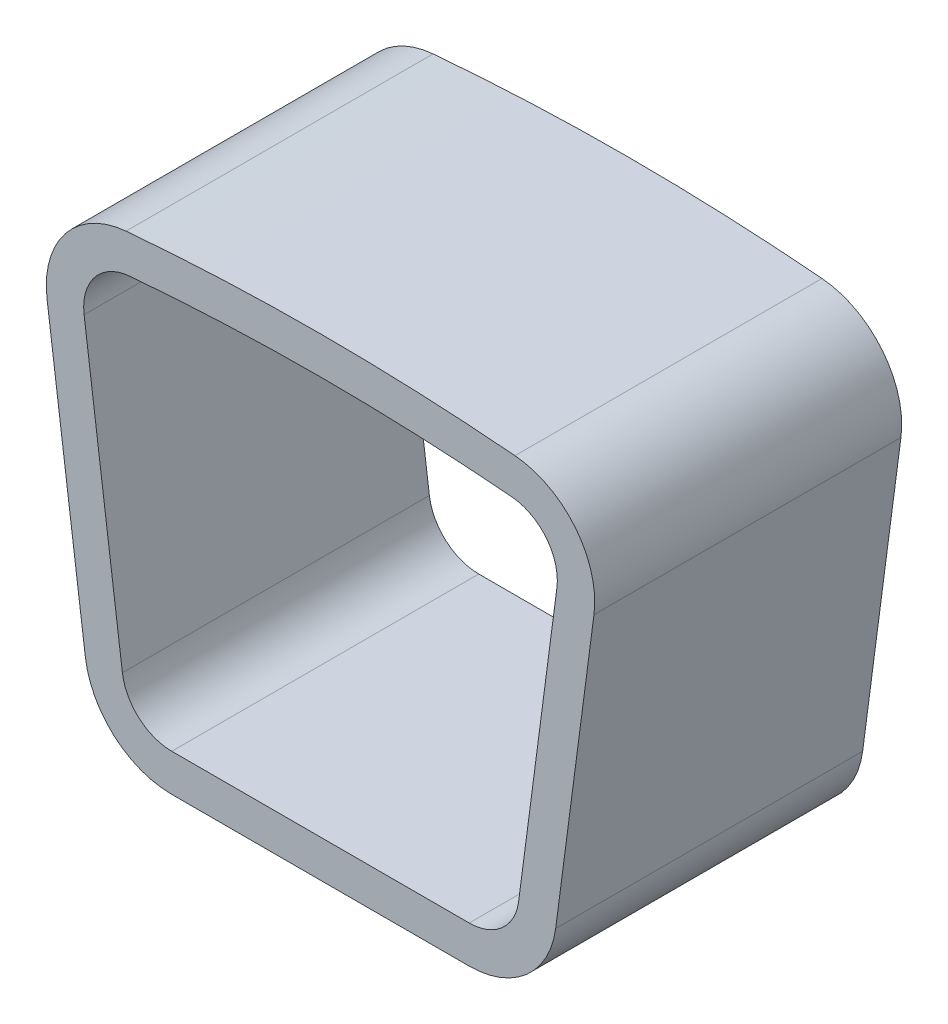
ISO-10303-21;
HEADER;
FILE_DESCRIPTION(('STEP AP214'),'2;1');
FILE_NAME('part.step','',(''),(''),'','','');
FILE_SCHEMA(('AUTOMOTIVE_DESIGN { 1 0 10303 214 1 1 1 1 }'));
ENDSEC;
DATA;
#1=APPLICATION_CONTEXT('core data for automotive mechanical design processes');
#2=APPLICATION_PROTOCOL_DEFINITION('international standard','automotive_design',2000,#1);
#3=PRODUCT_CONTEXT('',#1,'mechanical');
#4=PRODUCT('Part','Part','',(#3));
#5=PRODUCT_RELATED_PRODUCT_CATEGORY('part','',(#4));
#6=PRODUCT_DEFINITION_FORMATION('','',#4);
#7=PRODUCT_DEFINITION_CONTEXT('part definition',#1,'design');
#8=PRODUCT_DEFINITION('design','',#6,#7);
#9=PRODUCT_DEFINITION_SHAPE('','',#8);
#10=(LENGTH_UNIT() NAMED_UNIT(*) SI_UNIT(.MILLI.,.METRE.));
#11=(NAMED_UNIT(*) PLANE_ANGLE_UNIT() SI_UNIT($,.RADIAN.));
#12=(NAMED_UNIT(*) SI_UNIT($,.STERADIAN.) SOLID_ANGLE_UNIT());
#13=UNCERTAINTY_MEASURE_WITH_UNIT(LENGTH_MEASURE(1.E-05),#10,'distance_accuracy_value','');
#14=(GEOMETRIC_REPRESENTATION_CONTEXT(3) GLOBAL_UNCERTAINTY_ASSIGNED_CONTEXT((#13)) GLOBAL_UNIT_ASSIGNED_CONTEXT((#10,
#11,#12)) REPRESENTATION_CONTEXT('',''));
#15=CARTESIAN_POINT('',(0.,0.,0.));
#16=DIRECTION('',(0.,0.,1.));
#17=DIRECTION('',(1.,0.,0.));
#18=AXIS2_PLACEMENT_3D('',#15,#16,#17);
#19=CARTESIAN_POINT('',(-5.97107397432152,72.5,41.4069839661598));
#20=DIRECTION('',(0.,1.,0.));
#21=DIRECTION('',(-1.,0.,0.));
#22=AXIS2_PLACEMENT_3D('',#19,#20,#21);
#23=PLANE('',#22);
#24=DIRECTION('',(1.,0.,0.));
#25=VECTOR('',#24,1.);
#26=CARTESIAN_POINT('',(-5.97107397432152,72.5,12.325));
#27=LINE('',#26,#25);
#28=CARTESIAN_POINT('',(-5.97107397432152,72.5,12.325));
#29=VERTEX_POINT('',#28);
#30=CARTESIAN_POINT('',(5.97107397432167,72.5,12.325));
#31=VERTEX_POINT('',#30);
#32=EDGE_CURVE('E314',#29,#31,#27,.T.);
#33=ORIENTED_EDGE('',*,*,#32,.F.);
#34=DIRECTION('',(0.,0.,-1.));
#35=VECTOR('',#34,1.);
#36=CARTESIAN_POINT('',(-5.97107397432152,72.5,41.4069839661598));
#37=LINE('',#36,#35);
#38=CARTESIAN_POINT('',(-5.97107397432152,72.5,0.));
#39=VERTEX_POINT('',#38);
#40=EDGE_CURVE('E58',#29,#39,#37,.T.);
#41=ORIENTED_EDGE('',*,*,#40,.T.);
#42=DIRECTION('',(1.,0.,0.));
#43=VECTOR('',#42,1.);
#44=CARTESIAN_POINT('',(-5.97107397432152,72.5,0.));
#45=LINE('',#44,#43);
#46=CARTESIAN_POINT('',(5.97107397432167,72.5,0.));
#47=VERTEX_POINT('',#46);
#48=EDGE_CURVE('E209',#39,#47,#45,.T.);
#49=ORIENTED_EDGE('',*,*,#48,.T.);
#50=DIRECTION('',(0.,0.,-1.));
#51=VECTOR('',#50,1.);
#52=CARTESIAN_POINT('',(5.97107397432167,72.5,41.4069839661598));
#53=LINE('',#52,#51);
#54=EDGE_CURVE('E212',#31,#47,#53,.T.);
#55=ORIENTED_EDGE('',*,*,#54,.F.);
#56=EDGE_LOOP('',(#33,#41,#49,#55));
#57=FACE_BOUND('',#56,.T.);
#58=ADVANCED_FACE('F43',(#57),#23,.F.);
#59=CARTESIAN_POINT('',(-5.97107397432152,76.,41.4069839661598));
#60=DIRECTION('',(0.,0.,-1.));
#61=DIRECTION('',(-1.,0.,0.));
#62=AXIS2_PLACEMENT_3D('',#59,#60,#61);
#63=CYLINDRICAL_SURFACE('',#62,3.49999999999999);
#64=CARTESIAN_POINT('',(-5.97107397432152,76.,12.325));
#65=DIRECTION('',(0.,0.,1.));
#66=DIRECTION('',(1.,0.,0.));
#67=AXIS2_PLACEMENT_3D('',#64,#65,#66);
#68=CIRCLE('',#67,3.49999999999999);
#69=CARTESIAN_POINT('',(-9.44113098912984,75.5431583272298,12.325));
#70=VERTEX_POINT('',#69);
#71=EDGE_CURVE('E250',#70,#29,#68,.T.);
#72=ORIENTED_EDGE('',*,*,#71,.F.);
#73=DIRECTION('',(0.,0.,-1.));
#74=VECTOR('',#73,1.);
#75=CARTESIAN_POINT('',(-9.44113098912984,75.5431583272298,41.4069839661598));
#76=LINE('',#75,#74);
#77=CARTESIAN_POINT('',(-9.44113098912984,75.5431583272298,0.));
#78=VERTEX_POINT('',#77);
#79=EDGE_CURVE('E215',#70,#78,#76,.T.);
#80=ORIENTED_EDGE('',*,*,#79,.T.);
#81=CARTESIAN_POINT('',(-5.97107397432152,76.,0.));
#82=DIRECTION('',(0.,0.,1.));
#83=DIRECTION('',(1.,0.,0.));
#84=AXIS2_PLACEMENT_3D('',#81,#82,#83);
#85=CIRCLE('',#84,3.49999999999999);
#86=EDGE_CURVE('E207',#78,#39,#85,.T.);
#87=ORIENTED_EDGE('',*,*,#86,.T.);
#88=ORIENTED_EDGE('',*,*,#40,.F.);
#89=EDGE_LOOP('',(#72,#80,#87,#88));
#90=FACE_BOUND('',#89,.T.);
#91=ADVANCED_FACE('F247',(#90),#63,.T.);
#92=CARTESIAN_POINT('',(-10.978710331722,87.2222329423648,41.4069839661598));
#93=DIRECTION('',(0.99144486137381,0.130526192220056,0.));
#94=DIRECTION('',(-0.130526192220056,0.99144486137381,0.));
#95=AXIS2_PLACEMENT_3D('',#92,#93,#94);
#96=PLANE('',#95);
#97=DIRECTION('',(0.130526192220056,-0.99144486137381,0.));
#98=VECTOR('',#97,1.);
#99=CARTESIAN_POINT('',(-10.978710331722,87.2222329423648,12.325));
#100=LINE('',#99,#98);
#101=CARTESIAN_POINT('',(-10.978710331722,87.2222329423648,12.325));
#102=VERTEX_POINT('',#101);
#103=EDGE_CURVE('E255',#102,#70,#100,.T.);
#104=ORIENTED_EDGE('',*,*,#103,.F.);
#105=DIRECTION('',(0.,0.,-1.));
#106=VECTOR('',#105,1.);
#107=CARTESIAN_POINT('',(-10.978710331722,87.2222329423648,41.4069839661598));
#108=LINE('',#107,#106);
#109=CARTESIAN_POINT('',(-10.978710331722,87.2222329423648,0.));
#110=VERTEX_POINT('',#109);
#111=EDGE_CURVE('E217',#102,#110,#108,.T.);
#112=ORIENTED_EDGE('',*,*,#111,.T.);
#113=DIRECTION('',(0.130526192220056,-0.99144486137381,0.));
#114=VECTOR('',#113,1.);
#115=CARTESIAN_POINT('',(-10.978710331722,87.2222329423648,0.));
#116=LINE('',#115,#114);
#117=EDGE_CURVE('E204',#110,#78,#116,.T.);
#118=ORIENTED_EDGE('',*,*,#117,.T.);
#119=ORIENTED_EDGE('',*,*,#79,.F.);
#120=EDGE_LOOP('',(#104,#112,#118,#119));
#121=FACE_BOUND('',#120,.T.);
#122=ADVANCED_FACE('F253',(#121),#96,.F.);
#123=CARTESIAN_POINT('',(-7.50865331691368,87.679074615135,41.4069839661598));
#124=DIRECTION('',(0.,0.,-1.));
#125=DIRECTION('',(-1.,0.,0.));
#126=AXIS2_PLACEMENT_3D('',#123,#124,#125);
#127=CYLINDRICAL_SURFACE('',#126,3.49999999999998);
#128=CARTESIAN_POINT('',(-7.50865331691368,87.679074615135,12.325));
#129=DIRECTION('',(0.,0.,1.));
#130=DIRECTION('',(1.,0.,0.));
#131=AXIS2_PLACEMENT_3D('',#128,#129,#130);
#132=CIRCLE('',#131,3.49999999999998);
#133=CARTESIAN_POINT('',(-7.80729293747274,91.1663105373278,12.325));
#134=VERTEX_POINT('',#133);
#135=EDGE_CURVE('E318',#134,#102,#132,.T.);
#136=ORIENTED_EDGE('',*,*,#135,.F.);
#137=DIRECTION('',(0.,0.,-1.));
#138=VECTOR('',#137,1.);
#139=CARTESIAN_POINT('',(-7.80729293747274,91.1663105373278,41.4069839661598));
#140=LINE('',#139,#138);
#141=CARTESIAN_POINT('',(-7.80729293747274,91.1663105373278,0.));
#142=VERTEX_POINT('',#141);
#143=EDGE_CURVE('E219',#134,#142,#140,.T.);
#144=ORIENTED_EDGE('',*,*,#143,.T.);
#145=CARTESIAN_POINT('',(-7.50865331691368,87.679074615135,0.));
#146=DIRECTION('',(0.,0.,1.));
#147=DIRECTION('',(1.,0.,0.));
#148=AXIS2_PLACEMENT_3D('',#145,#146,#147);
#149=CIRCLE('',#148,3.49999999999998);
#150=EDGE_CURVE('E201',#142,#110,#149,.T.);
#151=ORIENTED_EDGE('',*,*,#150,.T.);
#152=ORIENTED_EDGE('',*,*,#111,.F.);
#153=EDGE_LOOP('',(#136,#144,#151,#152));
#154=FACE_BOUND('',#153,.T.);
#155=ADVANCED_FACE('F258',(#154),#127,.T.);
#156=CARTESIAN_POINT('',(0.,0.,41.4069839661598));
#157=DIRECTION('',(0.,0.,-1.));
#158=DIRECTION('',(-1.,0.,0.));
#159=AXIS2_PLACEMENT_3D('',#156,#157,#158);
#160=CYLINDRICAL_SURFACE('',#159,91.5);
#161=CARTESIAN_POINT('',(0.,0.,12.325));
#162=DIRECTION('',(0.,0.,1.));
#163=DIRECTION('',(1.,0.,0.));
#164=AXIS2_PLACEMENT_3D('',#161,#162,#163);
#165=CIRCLE('',#164,91.5);
#166=CARTESIAN_POINT('',(7.80729293747267,91.1663105373278,12.325));
#167=VERTEX_POINT('',#166);
#168=EDGE_CURVE('E264',#167,#134,#165,.T.);
#169=ORIENTED_EDGE('',*,*,#168,.F.);
#170=DIRECTION('',(0.,0.,-1.));
#171=VECTOR('',#170,1.);
#172=CARTESIAN_POINT('',(7.80729293747267,91.1663105373278,41.4069839661598));
#173=LINE('',#172,#171);
#174=CARTESIAN_POINT('',(7.80729293747267,91.1663105373278,0.));
#175=VERTEX_POINT('',#174);
#176=EDGE_CURVE('E221',#167,#175,#173,.T.);
#177=ORIENTED_EDGE('',*,*,#176,.T.);
#178=CARTESIAN_POINT('',(0.,0.,0.));
#179=DIRECTION('',(0.,0.,1.));
#180=DIRECTION('',(1.,0.,0.));
#181=AXIS2_PLACEMENT_3D('',#178,#179,#180);
#182=CIRCLE('',#181,91.5);
#183=EDGE_CURVE('E198',#175,#142,#182,.T.);
#184=ORIENTED_EDGE('',*,*,#183,.T.);
#185=ORIENTED_EDGE('',*,*,#143,.F.);
#186=EDGE_LOOP('',(#169,#177,#184,#185));
#187=FACE_BOUND('',#186,.T.);
#188=ADVANCED_FACE('F261',(#187),#160,.T.);
#189=CARTESIAN_POINT('',(7.5086533169136,87.679074615135,41.4069839661598));
#190=DIRECTION('',(0.,0.,-1.));
#191=DIRECTION('',(-1.,0.,0.));
#192=AXIS2_PLACEMENT_3D('',#189,#190,#191);
#193=CYLINDRICAL_SURFACE('',#192,3.49999999999998);
#194=CARTESIAN_POINT('',(7.5086533169136,87.679074615135,12.325));
#195=DIRECTION('',(0.,0.,1.));
#196=DIRECTION('',(1.,0.,0.));
#197=AXIS2_PLACEMENT_3D('',#194,#195,#196);
#198=CIRCLE('',#197,3.49999999999998);
#199=CARTESIAN_POINT('',(10.9787103317219,87.2222329423648,12.325));
#200=VERTEX_POINT('',#199);
#201=EDGE_CURVE('E268',#200,#167,#198,.T.);
#202=ORIENTED_EDGE('',*,*,#201,.F.);
#203=DIRECTION('',(0.,0.,-1.));
#204=VECTOR('',#203,1.);
#205=CARTESIAN_POINT('',(10.9787103317219,87.2222329423648,41.4069839661598));
#206=LINE('',#205,#204);
#207=CARTESIAN_POINT('',(10.9787103317219,87.2222329423648,0.));
#208=VERTEX_POINT('',#207);
#209=EDGE_CURVE('E223',#200,#208,#206,.T.);
#210=ORIENTED_EDGE('',*,*,#209,.T.);
#211=CARTESIAN_POINT('',(7.5086533169136,87.679074615135,0.));
#212=DIRECTION('',(0.,0.,1.));
#213=DIRECTION('',(1.,0.,0.));
#214=AXIS2_PLACEMENT_3D('',#211,#212,#213);
#215=CIRCLE('',#214,3.49999999999998);
#216=EDGE_CURVE('E195',#208,#175,#215,.T.);
#217=ORIENTED_EDGE('',*,*,#216,.T.);
#218=ORIENTED_EDGE('',*,*,#176,.F.);
#219=EDGE_LOOP('',(#202,#210,#217,#218));
#220=FACE_BOUND('',#219,.T.);
#221=ADVANCED_FACE('F267',(#220),#193,.T.);
#222=CARTESIAN_POINT('',(9.44113098912986,75.5431583272299,41.4069839661598));
#223=DIRECTION('',(-0.991444861373811,0.130526192220051,0.));
#224=DIRECTION('',(-0.130526192220051,-0.991444861373811,0.));
#225=AXIS2_PLACEMENT_3D('',#222,#223,#224);
#226=PLANE('',#225);
#227=DIRECTION('',(0.130526192220051,0.991444861373811,0.));
#228=VECTOR('',#227,1.);
#229=CARTESIAN_POINT('',(9.44113098912986,75.5431583272299,12.325));
#230=LINE('',#229,#228);
#231=CARTESIAN_POINT('',(9.44113098912986,75.5431583272299,12.325));
#232=VERTEX_POINT('',#231);
#233=EDGE_CURVE('E231',#232,#200,#230,.T.);
#234=ORIENTED_EDGE('',*,*,#233,.F.);
#235=DIRECTION('',(0.,0.,-1.));
#236=VECTOR('',#235,1.);
#237=CARTESIAN_POINT('',(9.44113098912986,75.5431583272299,41.4069839661598));
#238=LINE('',#237,#236);
#239=CARTESIAN_POINT('',(9.44113098912986,75.5431583272299,0.));
#240=VERTEX_POINT('',#239);
#241=EDGE_CURVE('E51',#232,#240,#238,.T.);
#242=ORIENTED_EDGE('',*,*,#241,.T.);
#243=DIRECTION('',(0.130526192220051,0.99144486137381,0.));
#244=VECTOR('',#243,1.);
#245=CARTESIAN_POINT('',(9.44113098912986,75.5431583272299,0.));
#246=LINE('',#245,#244);
#247=EDGE_CURVE('E192',#240,#208,#246,.T.);
#248=ORIENTED_EDGE('',*,*,#247,.T.);
#249=ORIENTED_EDGE('',*,*,#209,.F.);
#250=EDGE_LOOP('',(#234,#242,#248,#249));
#251=FACE_BOUND('',#250,.T.);
#252=ADVANCED_FACE('F227',(#251),#226,.F.);
#253=CARTESIAN_POINT('',(5.97107397432167,76.,41.4069839661598));
#254=DIRECTION('',(0.,0.,-1.));
#255=DIRECTION('',(-1.,0.,0.));
#256=AXIS2_PLACEMENT_3D('',#253,#254,#255);
#257=CYLINDRICAL_SURFACE('',#256,3.49999999999993);
#258=CARTESIAN_POINT('',(5.97107397432167,76.,12.325));
#259=DIRECTION('',(0.,0.,1.));
#260=DIRECTION('',(1.,0.,0.));
#261=AXIS2_PLACEMENT_3D('',#258,#259,#260);
#262=CIRCLE('',#261,3.49999999999993);
#263=EDGE_CURVE('E241',#31,#232,#262,.T.);
#264=ORIENTED_EDGE('',*,*,#263,.F.);
#265=ORIENTED_EDGE('',*,*,#54,.T.);
#266=CARTESIAN_POINT('',(5.97107397432167,76.,0.));
#267=DIRECTION('',(0.,0.,1.));
#268=DIRECTION('',(1.,0.,0.));
#269=AXIS2_PLACEMENT_3D('',#266,#267,#268);
#270=CIRCLE('',#269,3.49999999999993);
#271=EDGE_CURVE('E189',#47,#240,#270,.T.);
#272=ORIENTED_EDGE('',*,*,#271,.T.);
#273=ORIENTED_EDGE('',*,*,#241,.F.);
#274=EDGE_LOOP('',(#264,#265,#272,#273));
#275=FACE_BOUND('',#274,.T.);
#276=ADVANCED_FACE('F45',(#275),#257,.T.);
#277=CARTESIAN_POINT('',(5.97107397432167,76.,0.));
#278=DIRECTION('',(0.,0.,1.));
#279=DIRECTION('',(1.,0.,0.));
#280=AXIS2_PLACEMENT_3D('',#277,#278,#279);
#281=PLANE('',#280);
#282=ORIENTED_EDGE('',*,*,#271,.F.);
#283=ORIENTED_EDGE('',*,*,#48,.F.);
#284=ORIENTED_EDGE('',*,*,#86,.F.);
#285=ORIENTED_EDGE('',*,*,#117,.F.);
#286=ORIENTED_EDGE('',*,*,#150,.F.);
#287=ORIENTED_EDGE('',*,*,#183,.F.);
#288=ORIENTED_EDGE('',*,*,#216,.F.);
#289=ORIENTED_EDGE('',*,*,#247,.F.);
#290=EDGE_LOOP('',(#282,#283,#284,#285,#286,#287,#288,#289));
#291=FACE_BOUND('',#290,.T.);
#292=CARTESIAN_POINT('',(7.5086533169136,87.679074615135,0.));
#293=DIRECTION('',(0.,0.,1.));
#294=DIRECTION('',(1.,0.,0.));
#295=AXIS2_PLACEMENT_3D('',#292,#293,#294);
#296=CIRCLE('',#295,2.);
#297=CARTESIAN_POINT('',(9.4915430396612,87.4180222306949,0.));
#298=VERTEX_POINT('',#297);
#299=CARTESIAN_POINT('',(7.67930452866165,89.6717808563881,0.));
#300=VERTEX_POINT('',#299);
#301=EDGE_CURVE('E270',#298,#300,#296,.T.);
#302=ORIENTED_EDGE('',*,*,#301,.T.);
#303=CARTESIAN_POINT('',(0.,0.,0.));
#304=DIRECTION('',(0.,0.,1.));
#305=DIRECTION('',(1.,0.,0.));
#306=AXIS2_PLACEMENT_3D('',#303,#304,#305);
#307=CIRCLE('',#306,90.);
#308=CARTESIAN_POINT('',(-7.67930452866168,89.671780856388,0.));
#309=VERTEX_POINT('',#308);
#310=EDGE_CURVE('E277',#300,#309,#307,.T.);
#311=ORIENTED_EDGE('',*,*,#310,.T.);
#312=CARTESIAN_POINT('',(-7.50865331691365,87.679074615135,0.));
#313=DIRECTION('',(0.,0.,1.));
#314=DIRECTION('',(1.,0.,0.));
#315=AXIS2_PLACEMENT_3D('',#312,#313,#314);
#316=CIRCLE('',#315,2.);
#317=CARTESIAN_POINT('',(-9.49154303966127,87.4180222306949,0.));
#318=VERTEX_POINT('',#317);
#319=EDGE_CURVE('E280',#309,#318,#316,.T.);
#320=ORIENTED_EDGE('',*,*,#319,.T.);
#321=DIRECTION('',(0.130526192220053,-0.99144486137381,0.));
#322=VECTOR('',#321,1.);
#323=CARTESIAN_POINT('',(-9.49154303966128,87.4180222306949,0.));
#324=LINE('',#323,#322);
#325=CARTESIAN_POINT('',(-7.95396369706919,75.7389476155599,0.));
#326=VERTEX_POINT('',#325);
#327=EDGE_CURVE('E283',#318,#326,#324,.T.);
#328=ORIENTED_EDGE('',*,*,#327,.T.);
#329=CARTESIAN_POINT('',(-5.97107397432157,76.,0.));
#330=DIRECTION('',(0.,0.,1.));
#331=DIRECTION('',(1.,0.,0.));
#332=AXIS2_PLACEMENT_3D('',#329,#330,#331);
#333=CIRCLE('',#332,2.);
#334=CARTESIAN_POINT('',(-5.97107397432157,74.,0.));
#335=VERTEX_POINT('',#334);
#336=EDGE_CURVE('E286',#326,#335,#333,.T.);
#337=ORIENTED_EDGE('',*,*,#336,.T.);
#338=DIRECTION('',(1.,0.,0.));
#339=VECTOR('',#338,1.);
#340=CARTESIAN_POINT('',(-5.97107397432157,74.,0.));
#341=LINE('',#340,#339);
#342=CARTESIAN_POINT('',(5.97107397432167,74.,0.));
#343=VERTEX_POINT('',#342);
#344=EDGE_CURVE('E289',#335,#343,#341,.T.);
#345=ORIENTED_EDGE('',*,*,#344,.T.);
#346=CARTESIAN_POINT('',(5.97107397432167,76.,0.));
#347=DIRECTION('',(0.,0.,1.));
#348=DIRECTION('',(1.,0.,0.));
#349=AXIS2_PLACEMENT_3D('',#346,#347,#348);
#350=CIRCLE('',#349,1.99999999999996);
#351=CARTESIAN_POINT('',(7.95396369706925,75.7389476155599,0.));
#352=VERTEX_POINT('',#351);
#353=EDGE_CURVE('E292',#343,#352,#350,.T.);
#354=ORIENTED_EDGE('',*,*,#353,.T.);
#355=DIRECTION('',(0.130526192220045,0.991444861373811,0.));
#356=VECTOR('',#355,1.);
#357=CARTESIAN_POINT('',(7.95396369706922,75.7389476155599,0.));
#358=LINE('',#357,#356);
#359=EDGE_CURVE('E171',#352,#298,#358,.T.);
#360=ORIENTED_EDGE('',*,*,#359,.T.);
#361=EDGE_LOOP('',(#302,#311,#320,#328,#337,#345,#354,#360));
#362=FACE_BOUND('',#361,.T.);
#363=ADVANCED_FACE('F237',(#291,#362),#281,.F.);
#364=CARTESIAN_POINT('',(7.95396369706922,75.7389476155599,41.4069839661598));
#365=DIRECTION('',(-0.991444861373811,0.130526192220045,0.));
#366=DIRECTION('',(-0.130526192220045,-0.991444861373811,0.));
#367=AXIS2_PLACEMENT_3D('',#364,#365,#366);
#368=PLANE('',#367);
#369=DIRECTION('',(0.,0.,-1.));
#370=VECTOR('',#369,1.);
#371=CARTESIAN_POINT('',(7.95396369706925,75.7389476155599,41.4069839661598));
#372=LINE('',#371,#370);
#373=CARTESIAN_POINT('',(7.95396369706922,75.7389476155599,12.325));
#374=VERTEX_POINT('',#373);
#375=EDGE_CURVE('E163',#374,#352,#372,.T.);
#376=ORIENTED_EDGE('',*,*,#375,.F.);
#377=DIRECTION('',(0.130526192220045,0.991444861373811,0.));
#378=VECTOR('',#377,1.);
#379=CARTESIAN_POINT('',(7.95396369706922,75.7389476155599,12.325));
#380=LINE('',#379,#378);
#381=CARTESIAN_POINT('',(9.4915430396612,87.4180222306949,12.325));
#382=VERTEX_POINT('',#381);
#383=EDGE_CURVE('E11',#374,#382,#380,.T.);
#384=ORIENTED_EDGE('',*,*,#383,.T.);
#385=DIRECTION('',(0.,0.,-1.));
#386=VECTOR('',#385,1.);
#387=CARTESIAN_POINT('',(9.4915430396612,87.4180222306949,41.4069839661598));
#388=LINE('',#387,#386);
#389=EDGE_CURVE('E173',#382,#298,#388,.T.);
#390=ORIENTED_EDGE('',*,*,#389,.T.);
#391=ORIENTED_EDGE('',*,*,#359,.F.);
#392=EDGE_LOOP('',(#376,#384,#390,#391));
#393=FACE_BOUND('',#392,.T.);
#394=ADVANCED_FACE('F169',(#393),#368,.T.);
#395=CARTESIAN_POINT('',(5.97107397432167,76.,41.4069839661598));
#396=DIRECTION('',(0.,0.,-1.));
#397=DIRECTION('',(-1.,0.,0.));
#398=AXIS2_PLACEMENT_3D('',#395,#396,#397);
#399=CYLINDRICAL_SURFACE('',#398,1.99999999999996);
#400=DIRECTION('',(0.,0.,-1.));
#401=VECTOR('',#400,1.);
#402=CARTESIAN_POINT('',(5.97107397432167,74.,41.4069839661598));
#403=LINE('',#402,#401);
#404=CARTESIAN_POINT('',(5.97107397432167,74.0000000000001,12.325));
#405=VERTEX_POINT('',#404);
#406=EDGE_CURVE('E165',#405,#343,#403,.T.);
#407=ORIENTED_EDGE('',*,*,#406,.F.);
#408=CARTESIAN_POINT('',(5.97107397432167,76.,12.325));
#409=DIRECTION('',(0.,0.,1.));
#410=DIRECTION('',(1.,0.,0.));
#411=AXIS2_PLACEMENT_3D('',#408,#409,#410);
#412=CIRCLE('',#411,1.99999999999996);
#413=EDGE_CURVE('E156',#405,#374,#412,.T.);
#414=ORIENTED_EDGE('',*,*,#413,.T.);
#415=ORIENTED_EDGE('',*,*,#375,.T.);
#416=ORIENTED_EDGE('',*,*,#353,.F.);
#417=EDGE_LOOP('',(#407,#414,#415,#416));
#418=FACE_BOUND('',#417,.T.);
#419=ADVANCED_FACE('F161',(#418),#399,.F.);
#420=CARTESIAN_POINT('',(-5.97107397432157,74.,41.4069839661598));
#421=DIRECTION('',(0.,1.,0.));
#422=DIRECTION('',(-1.,0.,0.));
#423=AXIS2_PLACEMENT_3D('',#420,#421,#422);
#424=PLANE('',#423);
#425=DIRECTION('',(0.,0.,-1.));
#426=VECTOR('',#425,1.);
#427=CARTESIAN_POINT('',(-5.97107397432157,74.,41.4069839661598));
#428=LINE('',#427,#426);
#429=CARTESIAN_POINT('',(-5.97107397432157,74.,12.325));
#430=VERTEX_POINT('',#429);
#431=EDGE_CURVE('E175',#430,#335,#428,.T.);
#432=ORIENTED_EDGE('',*,*,#431,.F.);
#433=DIRECTION('',(1.,0.,0.));
#434=VECTOR('',#433,1.);
#435=CARTESIAN_POINT('',(-5.97107397432157,74.,12.325));
#436=LINE('',#435,#434);
#437=EDGE_CURVE('E167',#430,#405,#436,.T.);
#438=ORIENTED_EDGE('',*,*,#437,.T.);
#439=ORIENTED_EDGE('',*,*,#406,.T.);
#440=ORIENTED_EDGE('',*,*,#344,.F.);
#441=EDGE_LOOP('',(#432,#438,#439,#440));
#442=FACE_BOUND('',#441,.T.);
#443=ADVANCED_FACE('F298',(#442),#424,.T.);
#444=CARTESIAN_POINT('',(-5.97107397432157,76.,41.4069839661598));
#445=DIRECTION('',(0.,0.,-1.));
#446=DIRECTION('',(-1.,0.,0.));
#447=AXIS2_PLACEMENT_3D('',#444,#445,#446);
#448=CYLINDRICAL_SURFACE('',#447,2.);
#449=DIRECTION('',(0.,0.,-1.));
#450=VECTOR('',#449,1.);
#451=CARTESIAN_POINT('',(-7.95396369706919,75.7389476155599,41.4069839661598));
#452=LINE('',#451,#450);
#453=CARTESIAN_POINT('',(-7.95396369706919,75.7389476155599,12.325));
#454=VERTEX_POINT('',#453);
#455=EDGE_CURVE('E181',#454,#326,#452,.T.);
#456=ORIENTED_EDGE('',*,*,#455,.F.);
#457=CARTESIAN_POINT('',(-5.97107397432157,76.,12.325));
#458=DIRECTION('',(0.,0.,1.));
#459=DIRECTION('',(1.,0.,0.));
#460=AXIS2_PLACEMENT_3D('',#457,#458,#459);
#461=CIRCLE('',#460,2.);
#462=EDGE_CURVE('E300',#454,#430,#461,.T.);
#463=ORIENTED_EDGE('',*,*,#462,.T.);
#464=ORIENTED_EDGE('',*,*,#431,.T.);
#465=ORIENTED_EDGE('',*,*,#336,.F.);
#466=EDGE_LOOP('',(#456,#463,#464,#465));
#467=FACE_BOUND('',#466,.T.);
#468=ADVANCED_FACE('F335',(#467),#448,.F.);
#469=CARTESIAN_POINT('',(-9.49154303966128,87.4180222306949,41.4069839661598));
#470=DIRECTION('',(0.99144486137381,0.130526192220053,0.));
#471=DIRECTION('',(-0.130526192220053,0.99144486137381,0.));
#472=AXIS2_PLACEMENT_3D('',#469,#470,#471);
#473=PLANE('',#472);
#474=DIRECTION('',(0.,0.,-1.));
#475=VECTOR('',#474,1.);
#476=CARTESIAN_POINT('',(-9.49154303966127,87.4180222306949,41.4069839661598));
#477=LINE('',#476,#475);
#478=CARTESIAN_POINT('',(-9.49154303966128,87.4180222306949,12.325));
#479=VERTEX_POINT('',#478);
#480=EDGE_CURVE('E183',#479,#318,#477,.T.);
#481=ORIENTED_EDGE('',*,*,#480,.F.);
#482=DIRECTION('',(0.130526192220053,-0.99144486137381,0.));
#483=VECTOR('',#482,1.);
#484=CARTESIAN_POINT('',(-9.49154303966128,87.4180222306949,12.325));
#485=LINE('',#484,#483);
#486=EDGE_CURVE('E302',#479,#454,#485,.T.);
#487=ORIENTED_EDGE('',*,*,#486,.T.);
#488=ORIENTED_EDGE('',*,*,#455,.T.);
#489=ORIENTED_EDGE('',*,*,#327,.F.);
#490=EDGE_LOOP('',(#481,#487,#488,#489));
#491=FACE_BOUND('',#490,.T.);
#492=ADVANCED_FACE('F332',(#491),#473,.T.);
#493=CARTESIAN_POINT('',(-7.50865331691365,87.679074615135,41.4069839661598));
#494=DIRECTION('',(0.,0.,-1.));
#495=DIRECTION('',(-1.,0.,0.));
#496=AXIS2_PLACEMENT_3D('',#493,#494,#495);
#497=CYLINDRICAL_SURFACE('',#496,2.);
#498=DIRECTION('',(0.,0.,-1.));
#499=VECTOR('',#498,1.);
#500=CARTESIAN_POINT('',(-7.67930452866168,89.671780856388,41.4069839661598));
#501=LINE('',#500,#499);
#502=CARTESIAN_POINT('',(-7.67930452866168,89.671780856388,12.325));
#503=VERTEX_POINT('',#502);
#504=EDGE_CURVE('E185',#503,#309,#501,.T.);
#505=ORIENTED_EDGE('',*,*,#504,.F.);
#506=CARTESIAN_POINT('',(-7.50865331691365,87.679074615135,12.325));
#507=DIRECTION('',(0.,0.,1.));
#508=DIRECTION('',(1.,0.,0.));
#509=AXIS2_PLACEMENT_3D('',#506,#507,#508);
#510=CIRCLE('',#509,2.);
#511=EDGE_CURVE('E307',#503,#479,#510,.T.);
#512=ORIENTED_EDGE('',*,*,#511,.T.);
#513=ORIENTED_EDGE('',*,*,#480,.T.);
#514=ORIENTED_EDGE('',*,*,#319,.F.);
#515=EDGE_LOOP('',(#505,#512,#513,#514));
#516=FACE_BOUND('',#515,.T.);
#517=ADVANCED_FACE('F329',(#516),#497,.F.);
#518=CARTESIAN_POINT('',(0.,0.,41.4069839661598));
#519=DIRECTION('',(0.,0.,-1.));
#520=DIRECTION('',(-1.,0.,0.));
#521=AXIS2_PLACEMENT_3D('',#518,#519,#520);
#522=CYLINDRICAL_SURFACE('',#521,90.);
#523=DIRECTION('',(0.,0.,-1.));
#524=VECTOR('',#523,1.);
#525=CARTESIAN_POINT('',(7.67930452866165,89.6717808563881,41.4069839661598));
#526=LINE('',#525,#524);
#527=CARTESIAN_POINT('',(7.67930452866165,89.6717808563881,12.325));
#528=VERTEX_POINT('',#527);
#529=EDGE_CURVE('E187',#528,#300,#526,.T.);
#530=ORIENTED_EDGE('',*,*,#529,.F.);
#531=CARTESIAN_POINT('',(0.,0.,12.325));
#532=DIRECTION('',(0.,0.,1.));
#533=DIRECTION('',(1.,0.,0.));
#534=AXIS2_PLACEMENT_3D('',#531,#532,#533);
#535=CIRCLE('',#534,90.);
#536=EDGE_CURVE('E310',#528,#503,#535,.T.);
#537=ORIENTED_EDGE('',*,*,#536,.T.);
#538=ORIENTED_EDGE('',*,*,#504,.T.);
#539=ORIENTED_EDGE('',*,*,#310,.F.);
#540=EDGE_LOOP('',(#530,#537,#538,#539));
#541=FACE_BOUND('',#540,.T.);
#542=ADVANCED_FACE('F324',(#541),#522,.F.);
#543=CARTESIAN_POINT('',(7.5086533169136,87.679074615135,41.4069839661598));
#544=DIRECTION('',(0.,0.,-1.));
#545=DIRECTION('',(-1.,0.,0.));
#546=AXIS2_PLACEMENT_3D('',#543,#544,#545);
#547=CYLINDRICAL_SURFACE('',#546,2.);
#548=ORIENTED_EDGE('',*,*,#389,.F.);
#549=CARTESIAN_POINT('',(7.5086533169136,87.679074615135,12.325));
#550=DIRECTION('',(0.,0.,1.));
#551=DIRECTION('',(1.,0.,0.));
#552=AXIS2_PLACEMENT_3D('',#549,#550,#551);
#553=CIRCLE('',#552,2.);
#554=EDGE_CURVE('E66',#382,#528,#553,.T.);
#555=ORIENTED_EDGE('',*,*,#554,.T.);
#556=ORIENTED_EDGE('',*,*,#529,.T.);
#557=ORIENTED_EDGE('',*,*,#301,.F.);
#558=EDGE_LOOP('',(#548,#555,#556,#557));
#559=FACE_BOUND('',#558,.T.);
#560=ADVANCED_FACE('F320',(#559),#547,.F.);
#561=CARTESIAN_POINT('',(0.,0.,12.325));
#562=DIRECTION('',(0.,0.,1.));
#563=DIRECTION('',(1.,0.,0.));
#564=AXIS2_PLACEMENT_3D('',#561,#562,#563);
#565=PLANE('',#564);
#566=ORIENTED_EDGE('',*,*,#554,.F.);
#567=ORIENTED_EDGE('',*,*,#383,.F.);
#568=ORIENTED_EDGE('',*,*,#413,.F.);
#569=ORIENTED_EDGE('',*,*,#437,.F.);
#570=ORIENTED_EDGE('',*,*,#462,.F.);
#571=ORIENTED_EDGE('',*,*,#486,.F.);
#572=ORIENTED_EDGE('',*,*,#511,.F.);
#573=ORIENTED_EDGE('',*,*,#536,.F.);
#574=EDGE_LOOP('',(#566,#567,#568,#569,#570,#571,#572,#573));
#575=FACE_BOUND('',#574,.T.);
#576=ORIENTED_EDGE('',*,*,#32,.T.);
#577=ORIENTED_EDGE('',*,*,#263,.T.);
#578=ORIENTED_EDGE('',*,*,#233,.T.);
#579=ORIENTED_EDGE('',*,*,#201,.T.);
#580=ORIENTED_EDGE('',*,*,#168,.T.);
#581=ORIENTED_EDGE('',*,*,#135,.T.);
#582=ORIENTED_EDGE('',*,*,#103,.T.);
#583=ORIENTED_EDGE('',*,*,#71,.T.);
#584=EDGE_LOOP('',(#576,#577,#578,#579,#580,#581,#582,#583));
#585=FACE_BOUND('',#584,.T.);
#586=ADVANCED_FACE('F154',(#575,#585),#565,.T.);
#587=CLOSED_SHELL('',(#58,#91,#122,#155,#188,#221,#252,#276,#363,#394,#419,#443,#468,#492,#517,
#542,#560,#586));
#588=MANIFOLD_SOLID_BREP('B2',#587);
#589=ADVANCED_BREP_SHAPE_REPRESENTATION('',(#18,#588),#14);
#590=SHAPE_DEFINITION_REPRESENTATION(#9,#589);
ENDSEC;
END-ISO-10303-21;
